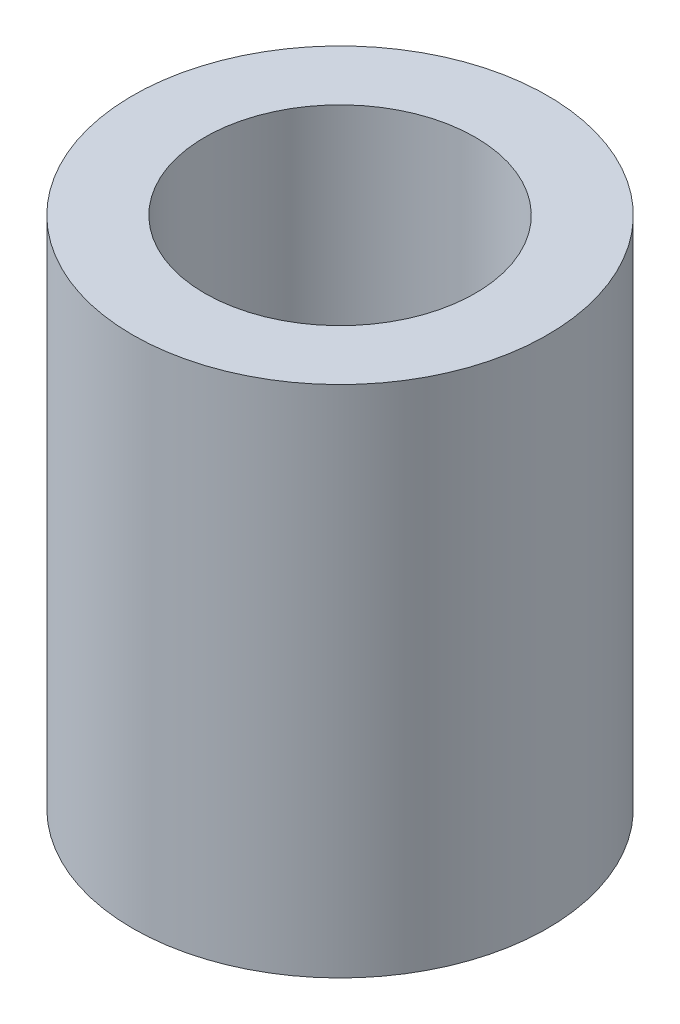
ISO-10303-21;
HEADER;
FILE_DESCRIPTION(('STEP AP214'),'2;1');
FILE_NAME('part.step','',(''),(''),'','','');
FILE_SCHEMA(('AUTOMOTIVE_DESIGN { 1 0 10303 214 1 1 1 1 }'));
ENDSEC;
DATA;
#1=APPLICATION_CONTEXT('core data for automotive mechanical design processes');
#2=APPLICATION_PROTOCOL_DEFINITION('international standard','automotive_design',2000,#1);
#3=PRODUCT_CONTEXT('',#1,'mechanical');
#4=PRODUCT('Part','Part','',(#3));
#5=PRODUCT_RELATED_PRODUCT_CATEGORY('part','',(#4));
#6=PRODUCT_DEFINITION_FORMATION('','',#4);
#7=PRODUCT_DEFINITION_CONTEXT('part definition',#1,'design');
#8=PRODUCT_DEFINITION('design','',#6,#7);
#9=PRODUCT_DEFINITION_SHAPE('','',#8);
#10=(LENGTH_UNIT() NAMED_UNIT(*) SI_UNIT(.MILLI.,.METRE.));
#11=(NAMED_UNIT(*) PLANE_ANGLE_UNIT() SI_UNIT($,.RADIAN.));
#12=(NAMED_UNIT(*) SI_UNIT($,.STERADIAN.) SOLID_ANGLE_UNIT());
#13=UNCERTAINTY_MEASURE_WITH_UNIT(LENGTH_MEASURE(1.E-05),#10,'distance_accuracy_value','');
#14=(GEOMETRIC_REPRESENTATION_CONTEXT(3) GLOBAL_UNCERTAINTY_ASSIGNED_CONTEXT((#13)) GLOBAL_UNIT_ASSIGNED_CONTEXT((#10,
#11,#12)) REPRESENTATION_CONTEXT('',''));
#15=CARTESIAN_POINT('',(0.,0.,0.));
#16=DIRECTION('',(0.,0.,1.));
#17=DIRECTION('',(1.,0.,0.));
#18=AXIS2_PLACEMENT_3D('',#15,#16,#17);
#19=CARTESIAN_POINT('',(0.,5.7,0.));
#20=DIRECTION('',(0.,1.,0.));
#21=DIRECTION('',(0.,0.,1.));
#22=AXIS2_PLACEMENT_3D('',#19,#20,#21);
#23=PLANE('',#22);
#24=CARTESIAN_POINT('',(0.,5.7,0.));
#25=DIRECTION('',(0.,1.,0.));
#26=DIRECTION('',(0.,0.,1.));
#27=AXIS2_PLACEMENT_3D('',#24,#25,#26);
#28=CIRCLE('',#27,2.3);
#29=CARTESIAN_POINT('',(0.,5.7,2.3));
#30=VERTEX_POINT('',#29);
#31=EDGE_CURVE('E10',#30,#30,#28,.T.);
#32=ORIENTED_EDGE('',*,*,#31,.T.);
#33=EDGE_LOOP('',(#32));
#34=FACE_BOUND('',#33,.T.);
#35=CARTESIAN_POINT('',(0.,5.7,0.));
#36=DIRECTION('',(0.,1.,0.));
#37=DIRECTION('',(0.,0.,1.));
#38=AXIS2_PLACEMENT_3D('',#35,#36,#37);
#39=CIRCLE('',#38,1.5);
#40=CARTESIAN_POINT('',(0.,5.7,1.5));
#41=VERTEX_POINT('',#40);
#42=EDGE_CURVE('E45',#41,#41,#39,.T.);
#43=ORIENTED_EDGE('',*,*,#42,.F.);
#44=EDGE_LOOP('',(#43));
#45=FACE_BOUND('',#44,.T.);
#46=ADVANCED_FACE('F34',(#34,#45),#23,.T.);
#47=CARTESIAN_POINT('',(0.,0.,0.));
#48=DIRECTION('',(0.,1.,0.));
#49=DIRECTION('',(0.,0.,1.));
#50=AXIS2_PLACEMENT_3D('',#47,#48,#49);
#51=PLANE('',#50);
#52=CARTESIAN_POINT('',(0.,0.,0.));
#53=DIRECTION('',(0.,1.,0.));
#54=DIRECTION('',(0.,0.,1.));
#55=AXIS2_PLACEMENT_3D('',#52,#53,#54);
#56=CIRCLE('',#55,2.3);
#57=CARTESIAN_POINT('',(0.,0.,2.3));
#58=VERTEX_POINT('',#57);
#59=EDGE_CURVE('E38',#58,#58,#56,.T.);
#60=ORIENTED_EDGE('',*,*,#59,.F.);
#61=EDGE_LOOP('',(#60));
#62=FACE_BOUND('',#61,.T.);
#63=CARTESIAN_POINT('',(0.,0.,0.));
#64=DIRECTION('',(0.,1.,0.));
#65=DIRECTION('',(0.,0.,1.));
#66=AXIS2_PLACEMENT_3D('',#63,#64,#65);
#67=CIRCLE('',#66,1.5);
#68=CARTESIAN_POINT('',(0.,0.,1.5));
#69=VERTEX_POINT('',#68);
#70=EDGE_CURVE('E47',#69,#69,#67,.T.);
#71=ORIENTED_EDGE('',*,*,#70,.T.);
#72=EDGE_LOOP('',(#71));
#73=FACE_BOUND('',#72,.T.);
#74=ADVANCED_FACE('F57',(#62,#73),#51,.F.);
#75=CARTESIAN_POINT('',(0.,5.7,0.));
#76=DIRECTION('',(0.,-1.,0.));
#77=DIRECTION('',(0.,0.,-1.));
#78=AXIS2_PLACEMENT_3D('',#75,#76,#77);
#79=CYLINDRICAL_SURFACE('',#78,2.3);
#80=ORIENTED_EDGE('',*,*,#31,.F.);
#81=EDGE_LOOP('',(#80));
#82=FACE_BOUND('',#81,.T.);
#83=ORIENTED_EDGE('',*,*,#59,.T.);
#84=EDGE_LOOP('',(#83));
#85=FACE_BOUND('',#84,.T.);
#86=ADVANCED_FACE('F36',(#82,#85),#79,.T.);
#87=CARTESIAN_POINT('',(0.,5.7,0.));
#88=DIRECTION('',(0.,-1.,0.));
#89=DIRECTION('',(0.,0.,-1.));
#90=AXIS2_PLACEMENT_3D('',#87,#88,#89);
#91=CYLINDRICAL_SURFACE('',#90,1.5);
#92=ORIENTED_EDGE('',*,*,#42,.T.);
#93=EDGE_LOOP('',(#92));
#94=FACE_BOUND('',#93,.T.);
#95=ORIENTED_EDGE('',*,*,#70,.F.);
#96=EDGE_LOOP('',(#95));
#97=FACE_BOUND('',#96,.T.);
#98=ADVANCED_FACE('F53',(#94,#97),#91,.F.);
#99=CLOSED_SHELL('',(#46,#74,#86,#98));
#100=MANIFOLD_SOLID_BREP('B2',#99);
#101=ADVANCED_BREP_SHAPE_REPRESENTATION('',(#18,#100),#14);
#102=SHAPE_DEFINITION_REPRESENTATION(#9,#101);
ENDSEC;
END-ISO-10303-21;
